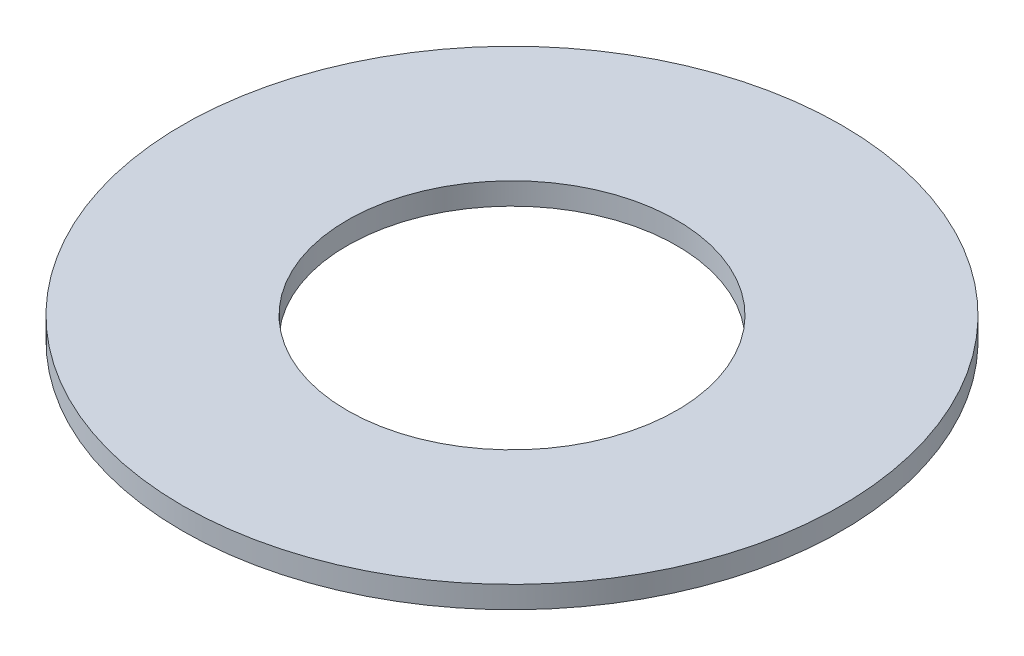
ISO-10303-21;
HEADER;
FILE_DESCRIPTION(('STEP AP214'),'2;1');
FILE_NAME('part.step','',(''),(''),'','','');
FILE_SCHEMA(('AUTOMOTIVE_DESIGN { 1 0 10303 214 1 1 1 1 }'));
ENDSEC;
DATA;
#1=APPLICATION_CONTEXT('core data for automotive mechanical design processes');
#2=APPLICATION_PROTOCOL_DEFINITION('international standard','automotive_design',2000,#1);
#3=PRODUCT_CONTEXT('',#1,'mechanical');
#4=PRODUCT('Part','Part','',(#3));
#5=PRODUCT_RELATED_PRODUCT_CATEGORY('part','',(#4));
#6=PRODUCT_DEFINITION_FORMATION('','',#4);
#7=PRODUCT_DEFINITION_CONTEXT('part definition',#1,'design');
#8=PRODUCT_DEFINITION('design','',#6,#7);
#9=PRODUCT_DEFINITION_SHAPE('','',#8);
#10=(LENGTH_UNIT() NAMED_UNIT(*) SI_UNIT(.MILLI.,.METRE.));
#11=(NAMED_UNIT(*) PLANE_ANGLE_UNIT() SI_UNIT($,.RADIAN.));
#12=(NAMED_UNIT(*) SI_UNIT($,.STERADIAN.) SOLID_ANGLE_UNIT());
#13=UNCERTAINTY_MEASURE_WITH_UNIT(LENGTH_MEASURE(1.E-05),#10,'distance_accuracy_value','');
#14=(GEOMETRIC_REPRESENTATION_CONTEXT(3) GLOBAL_UNCERTAINTY_ASSIGNED_CONTEXT((#13)) GLOBAL_UNIT_ASSIGNED_CONTEXT((#10,
#11,#12)) REPRESENTATION_CONTEXT('',''));
#15=CARTESIAN_POINT('',(0.,0.,0.));
#16=DIRECTION('',(0.,0.,1.));
#17=DIRECTION('',(1.,0.,0.));
#18=AXIS2_PLACEMENT_3D('',#15,#16,#17);
#19=CARTESIAN_POINT('',(0.,1.27,0.));
#20=DIRECTION('',(0.,1.,0.));
#21=DIRECTION('',(0.,0.,1.));
#22=AXIS2_PLACEMENT_3D('',#19,#20,#21);
#23=PLANE('',#22);
#24=CARTESIAN_POINT('',(0.,1.27,0.));
#25=DIRECTION('',(0.,1.,0.));
#26=DIRECTION('',(0.,0.,1.));
#27=AXIS2_PLACEMENT_3D('',#24,#25,#26);
#28=CIRCLE('',#27,19.05);
#29=CARTESIAN_POINT('',(0.,1.27,19.05));
#30=VERTEX_POINT('',#29);
#31=EDGE_CURVE('E10',#30,#30,#28,.T.);
#32=ORIENTED_EDGE('',*,*,#31,.T.);
#33=EDGE_LOOP('',(#32));
#34=FACE_BOUND('',#33,.T.);
#35=CARTESIAN_POINT('',(0.,1.27,0.));
#36=DIRECTION('',(0.,1.,0.));
#37=DIRECTION('',(0.,0.,1.));
#38=AXIS2_PLACEMENT_3D('',#35,#36,#37);
#39=CIRCLE('',#38,9.525);
#40=CARTESIAN_POINT('',(0.,1.27,9.525));
#41=VERTEX_POINT('',#40);
#42=EDGE_CURVE('E54',#41,#41,#39,.T.);
#43=ORIENTED_EDGE('',*,*,#42,.F.);
#44=EDGE_LOOP('',(#43));
#45=FACE_BOUND('',#44,.T.);
#46=ADVANCED_FACE('F41',(#34,#45),#23,.T.);
#47=CARTESIAN_POINT('',(0.,0.,0.));
#48=DIRECTION('',(0.,1.,0.));
#49=DIRECTION('',(0.,0.,1.));
#50=AXIS2_PLACEMENT_3D('',#47,#48,#49);
#51=PLANE('',#50);
#52=CARTESIAN_POINT('',(0.,0.,0.));
#53=DIRECTION('',(0.,1.,0.));
#54=DIRECTION('',(0.,0.,1.));
#55=AXIS2_PLACEMENT_3D('',#52,#53,#54);
#56=CIRCLE('',#55,19.05);
#57=CARTESIAN_POINT('',(0.,0.,19.05));
#58=VERTEX_POINT('',#57);
#59=EDGE_CURVE('E45',#58,#58,#56,.T.);
#60=ORIENTED_EDGE('',*,*,#59,.F.);
#61=EDGE_LOOP('',(#60));
#62=FACE_BOUND('',#61,.T.);
#63=CARTESIAN_POINT('',(0.,0.,0.));
#64=DIRECTION('',(0.,1.,0.));
#65=DIRECTION('',(0.,0.,1.));
#66=AXIS2_PLACEMENT_3D('',#63,#64,#65);
#67=CIRCLE('',#66,9.525);
#68=CARTESIAN_POINT('',(0.,0.,9.525));
#69=VERTEX_POINT('',#68);
#70=EDGE_CURVE('E56',#69,#69,#67,.T.);
#71=ORIENTED_EDGE('',*,*,#70,.T.);
#72=EDGE_LOOP('',(#71));
#73=FACE_BOUND('',#72,.T.);
#74=ADVANCED_FACE('F68',(#62,#73),#51,.F.);
#75=CARTESIAN_POINT('',(0.,1.27,0.));
#76=DIRECTION('',(0.,-1.,0.));
#77=DIRECTION('',(0.,0.,-1.));
#78=AXIS2_PLACEMENT_3D('',#75,#76,#77);
#79=CYLINDRICAL_SURFACE('',#78,19.05);
#80=ORIENTED_EDGE('',*,*,#31,.F.);
#81=EDGE_LOOP('',(#80));
#82=FACE_BOUND('',#81,.T.);
#83=ORIENTED_EDGE('',*,*,#59,.T.);
#84=EDGE_LOOP('',(#83));
#85=FACE_BOUND('',#84,.T.);
#86=ADVANCED_FACE('F43',(#82,#85),#79,.T.);
#87=CARTESIAN_POINT('',(0.,1.27,0.));
#88=DIRECTION('',(0.,-1.,0.));
#89=DIRECTION('',(0.,0.,-1.));
#90=AXIS2_PLACEMENT_3D('',#87,#88,#89);
#91=CYLINDRICAL_SURFACE('',#90,9.525);
#92=ORIENTED_EDGE('',*,*,#42,.T.);
#93=EDGE_LOOP('',(#92));
#94=FACE_BOUND('',#93,.T.);
#95=ORIENTED_EDGE('',*,*,#70,.F.);
#96=EDGE_LOOP('',(#95));
#97=FACE_BOUND('',#96,.T.);
#98=ADVANCED_FACE('F64',(#94,#97),#91,.F.);
#99=CLOSED_SHELL('',(#46,#74,#86,#98));
#100=MANIFOLD_SOLID_BREP('B2',#99);
#101=ADVANCED_BREP_SHAPE_REPRESENTATION('',(#18,#100),#14);
#102=SHAPE_DEFINITION_REPRESENTATION(#9,#101);
ENDSEC;
END-ISO-10303-21;
